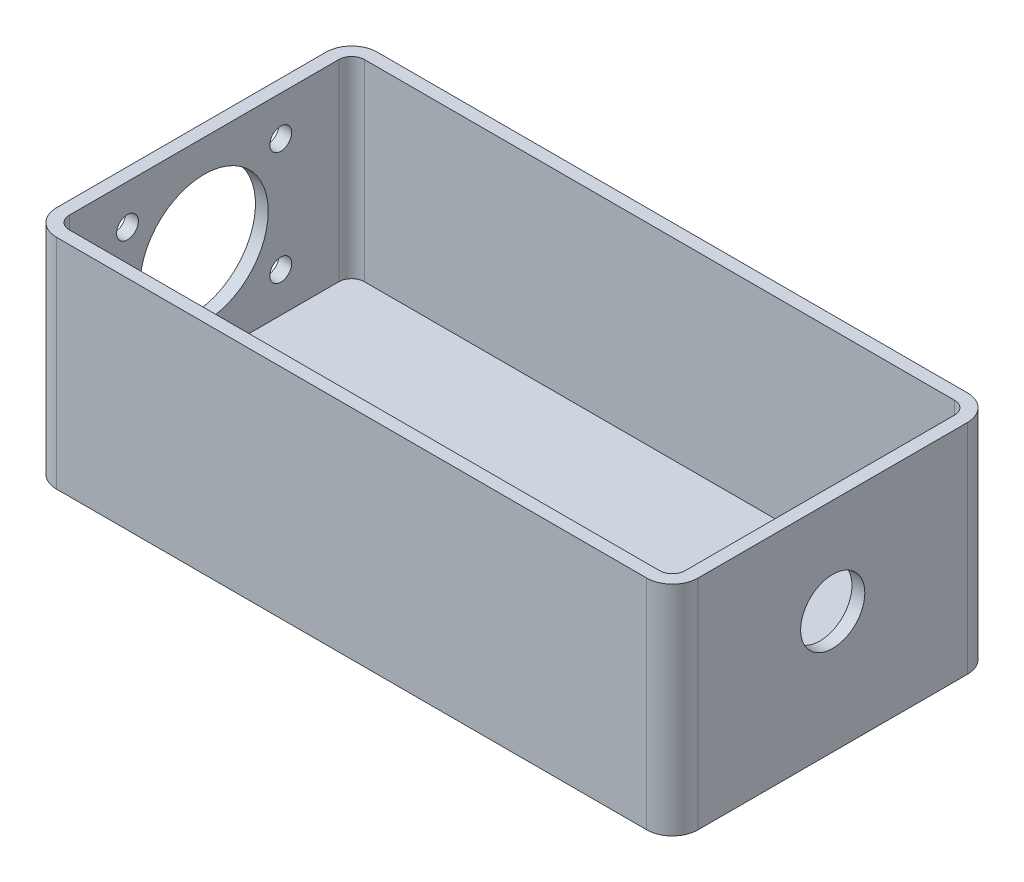
ISO-10303-21;
HEADER;
FILE_DESCRIPTION(('STEP AP214'),'2;1');
FILE_NAME('part.step','',(''),(''),'','','');
FILE_SCHEMA(('AUTOMOTIVE_DESIGN { 1 0 10303 214 1 1 1 1 }'));
ENDSEC;
DATA;
#1=APPLICATION_CONTEXT('core data for automotive mechanical design processes');
#2=APPLICATION_PROTOCOL_DEFINITION('international standard','automotive_design',2000,#1);
#3=PRODUCT_CONTEXT('',#1,'mechanical');
#4=PRODUCT('Part','Part','',(#3));
#5=PRODUCT_RELATED_PRODUCT_CATEGORY('part','',(#4));
#6=PRODUCT_DEFINITION_FORMATION('','',#4);
#7=PRODUCT_DEFINITION_CONTEXT('part definition',#1,'design');
#8=PRODUCT_DEFINITION('design','',#6,#7);
#9=PRODUCT_DEFINITION_SHAPE('','',#8);
#10=(LENGTH_UNIT() NAMED_UNIT(*) SI_UNIT(.MILLI.,.METRE.));
#11=(NAMED_UNIT(*) PLANE_ANGLE_UNIT() SI_UNIT($,.RADIAN.));
#12=(NAMED_UNIT(*) SI_UNIT($,.STERADIAN.) SOLID_ANGLE_UNIT());
#13=UNCERTAINTY_MEASURE_WITH_UNIT(LENGTH_MEASURE(1.E-05),#10,'distance_accuracy_value','');
#14=(GEOMETRIC_REPRESENTATION_CONTEXT(3) GLOBAL_UNCERTAINTY_ASSIGNED_CONTEXT((#13)) GLOBAL_UNIT_ASSIGNED_CONTEXT((#10,
#11,#12)) REPRESENTATION_CONTEXT('',''));
#15=CARTESIAN_POINT('',(0.,0.,0.));
#16=DIRECTION('',(0.,0.,1.));
#17=DIRECTION('',(1.,0.,0.));
#18=AXIS2_PLACEMENT_3D('',#15,#16,#17);
#19=CARTESIAN_POINT('',(0.,5.08,0.));
#20=DIRECTION('',(1.,0.,0.));
#21=DIRECTION('',(0.,0.,-1.));
#22=AXIS2_PLACEMENT_3D('',#19,#20,#21);
#23=PLANE('',#22);
#24=CARTESIAN_POINT('',(0.,12.9032,-16.5735));
#25=DIRECTION('',(-1.,0.,0.));
#26=DIRECTION('',(0.,0.,1.));
#27=AXIS2_PLACEMENT_3D('',#24,#25,#26);
#28=CIRCLE('',#27,2.159);
#29=CARTESIAN_POINT('',(0.,12.9032,-14.4145));
#30=VERTEX_POINT('',#29);
#31=EDGE_CURVE('E569',#30,#30,#28,.T.);
#32=ORIENTED_EDGE('',*,*,#31,.F.);
#33=EDGE_LOOP('',(#32));
#34=FACE_BOUND('',#33,.T.);
#35=CARTESIAN_POINT('',(0.,12.9032,-46.9265));
#36=DIRECTION('',(-1.,0.,0.));
#37=DIRECTION('',(0.,0.,1.));
#38=AXIS2_PLACEMENT_3D('',#35,#36,#37);
#39=CIRCLE('',#38,2.159);
#40=CARTESIAN_POINT('',(0.,12.9032,-44.7675));
#41=VERTEX_POINT('',#40);
#42=EDGE_CURVE('E577',#41,#41,#39,.T.);
#43=ORIENTED_EDGE('',*,*,#42,.F.);
#44=EDGE_LOOP('',(#43));
#45=FACE_BOUND('',#44,.T.);
#46=CARTESIAN_POINT('',(0.,35.3568,-16.5735));
#47=DIRECTION('',(-1.,0.,0.));
#48=DIRECTION('',(0.,0.,1.));
#49=AXIS2_PLACEMENT_3D('',#46,#47,#48);
#50=CIRCLE('',#49,2.159);
#51=CARTESIAN_POINT('',(0.,35.3568,-14.4145));
#52=VERTEX_POINT('',#51);
#53=EDGE_CURVE('E583',#52,#52,#50,.T.);
#54=ORIENTED_EDGE('',*,*,#53,.F.);
#55=EDGE_LOOP('',(#54));
#56=FACE_BOUND('',#55,.T.);
#57=CARTESIAN_POINT('',(0.,35.3568,-46.9265));
#58=DIRECTION('',(-1.,0.,0.));
#59=DIRECTION('',(0.,0.,1.));
#60=AXIS2_PLACEMENT_3D('',#57,#58,#59);
#61=CIRCLE('',#60,2.159);
#62=CARTESIAN_POINT('',(0.,35.3568,-44.7675));
#63=VERTEX_POINT('',#62);
#64=EDGE_CURVE('E557',#63,#63,#61,.T.);
#65=ORIENTED_EDGE('',*,*,#64,.F.);
#66=EDGE_LOOP('',(#65));
#67=FACE_BOUND('',#66,.T.);
#68=CARTESIAN_POINT('',(0.,24.13,-31.75));
#69=DIRECTION('',(-1.,0.,0.));
#70=DIRECTION('',(0.,0.,1.));
#71=AXIS2_PLACEMENT_3D('',#68,#69,#70);
#72=CIRCLE('',#71,12.7);
#73=CARTESIAN_POINT('',(0.,24.13,-19.05));
#74=VERTEX_POINT('',#73);
#75=EDGE_CURVE('E276',#74,#74,#72,.T.);
#76=ORIENTED_EDGE('',*,*,#75,.F.);
#77=EDGE_LOOP('',(#76));
#78=FACE_BOUND('',#77,.T.);
#79=DIRECTION('',(0.,0.,1.));
#80=VECTOR('',#79,1.);
#81=CARTESIAN_POINT('',(0.,43.18,-63.5));
#82=LINE('',#81,#80);
#83=CARTESIAN_POINT('',(0.,43.18,-58.42));
#84=VERTEX_POINT('',#83);
#85=CARTESIAN_POINT('',(0.,43.18,-5.08));
#86=VERTEX_POINT('',#85);
#87=EDGE_CURVE('E165',#84,#86,#82,.T.);
#88=ORIENTED_EDGE('',*,*,#87,.F.);
#89=DIRECTION('',(0.,-1.,0.));
#90=VECTOR('',#89,1.);
#91=CARTESIAN_POINT('',(0.,5.08,-58.42));
#92=LINE('',#91,#90);
#93=CARTESIAN_POINT('',(0.,0.,-58.42));
#94=VERTEX_POINT('',#93);
#95=EDGE_CURVE('E150',#84,#94,#92,.T.);
#96=ORIENTED_EDGE('',*,*,#95,.T.);
#97=DIRECTION('',(0.,0.,1.));
#98=VECTOR('',#97,1.);
#99=CARTESIAN_POINT('',(0.,0.,0.));
#100=LINE('',#99,#98);
#101=CARTESIAN_POINT('',(0.,0.,-5.08));
#102=VERTEX_POINT('',#101);
#103=EDGE_CURVE('E162',#94,#102,#100,.T.);
#104=ORIENTED_EDGE('',*,*,#103,.T.);
#105=DIRECTION('',(0.,-1.,0.));
#106=VECTOR('',#105,1.);
#107=CARTESIAN_POINT('',(0.,5.08,-5.08));
#108=LINE('',#107,#106);
#109=EDGE_CURVE('E167',#102,#86,#108,.F.);
#110=ORIENTED_EDGE('',*,*,#109,.T.);
#111=EDGE_LOOP('',(#88,#96,#104,#110));
#112=FACE_BOUND('',#111,.T.);
#113=ADVANCED_FACE('F33',(#34,#45,#56,#67,#78,#112),#23,.F.);
#114=CARTESIAN_POINT('',(0.,5.08,0.));
#115=DIRECTION('',(0.,0.,-1.));
#116=DIRECTION('',(-1.,0.,0.));
#117=AXIS2_PLACEMENT_3D('',#114,#115,#116);
#118=PLANE('',#117);
#119=DIRECTION('',(1.,0.,0.));
#120=VECTOR('',#119,1.);
#121=CARTESIAN_POINT('',(0.,0.,0.));
#122=LINE('',#121,#120);
#123=CARTESIAN_POINT('',(5.08,0.,0.));
#124=VERTEX_POINT('',#123);
#125=CARTESIAN_POINT('',(121.92,0.,0.));
#126=VERTEX_POINT('',#125);
#127=EDGE_CURVE('E171',#124,#126,#122,.T.);
#128=ORIENTED_EDGE('',*,*,#127,.T.);
#129=DIRECTION('',(0.,-1.,0.));
#130=VECTOR('',#129,1.);
#131=CARTESIAN_POINT('',(121.92,5.08,0.));
#132=LINE('',#131,#130);
#133=CARTESIAN_POINT('',(121.92,43.18,0.));
#134=VERTEX_POINT('',#133);
#135=EDGE_CURVE('E210',#126,#134,#132,.F.);
#136=ORIENTED_EDGE('',*,*,#135,.T.);
#137=DIRECTION('',(1.,0.,0.));
#138=VECTOR('',#137,1.);
#139=CARTESIAN_POINT('',(0.,43.18,0.));
#140=LINE('',#139,#138);
#141=CARTESIAN_POINT('',(5.08,43.18,0.));
#142=VERTEX_POINT('',#141);
#143=EDGE_CURVE('E282',#142,#134,#140,.T.);
#144=ORIENTED_EDGE('',*,*,#143,.F.);
#145=DIRECTION('',(0.,-1.,0.));
#146=VECTOR('',#145,1.);
#147=CARTESIAN_POINT('',(5.08,5.08,0.));
#148=LINE('',#147,#146);
#149=EDGE_CURVE('E207',#142,#124,#148,.T.);
#150=ORIENTED_EDGE('',*,*,#149,.T.);
#151=EDGE_LOOP('',(#128,#136,#144,#150));
#152=FACE_BOUND('',#151,.T.);
#153=ADVANCED_FACE('F305',(#152),#118,.F.);
#154=CARTESIAN_POINT('',(127.,5.08,0.));
#155=DIRECTION('',(-1.,0.,0.));
#156=DIRECTION('',(0.,0.,1.));
#157=AXIS2_PLACEMENT_3D('',#154,#155,#156);
#158=PLANE('',#157);
#159=CARTESIAN_POINT('',(127.,24.13,-31.75));
#160=DIRECTION('',(1.,0.,0.));
#161=DIRECTION('',(0.,0.,-1.));
#162=AXIS2_PLACEMENT_3D('',#159,#160,#161);
#163=CIRCLE('',#162,6.35);
#164=CARTESIAN_POINT('',(127.,24.13,-38.1));
#165=VERTEX_POINT('',#164);
#166=EDGE_CURVE('E576',#165,#165,#163,.T.);
#167=ORIENTED_EDGE('',*,*,#166,.F.);
#168=EDGE_LOOP('',(#167));
#169=FACE_BOUND('',#168,.T.);
#170=DIRECTION('',(0.,0.,-1.));
#171=VECTOR('',#170,1.);
#172=CARTESIAN_POINT('',(127.,0.,0.));
#173=LINE('',#172,#171);
#174=CARTESIAN_POINT('',(127.,0.,-5.08));
#175=VERTEX_POINT('',#174);
#176=CARTESIAN_POINT('',(127.,0.,-58.42));
#177=VERTEX_POINT('',#176);
#178=EDGE_CURVE('E175',#175,#177,#173,.T.);
#179=ORIENTED_EDGE('',*,*,#178,.T.);
#180=DIRECTION('',(0.,-1.,0.));
#181=VECTOR('',#180,1.);
#182=CARTESIAN_POINT('',(127.,5.08,-58.42));
#183=LINE('',#182,#181);
#184=CARTESIAN_POINT('',(127.,43.18,-58.42));
#185=VERTEX_POINT('',#184);
#186=EDGE_CURVE('E205',#177,#185,#183,.F.);
#187=ORIENTED_EDGE('',*,*,#186,.T.);
#188=DIRECTION('',(0.,0.,-1.));
#189=VECTOR('',#188,1.);
#190=CARTESIAN_POINT('',(127.,43.18,-63.5));
#191=LINE('',#190,#189);
#192=CARTESIAN_POINT('',(127.,43.18,-5.08));
#193=VERTEX_POINT('',#192);
#194=EDGE_CURVE('E178',#193,#185,#191,.T.);
#195=ORIENTED_EDGE('',*,*,#194,.F.);
#196=DIRECTION('',(0.,-1.,0.));
#197=VECTOR('',#196,1.);
#198=CARTESIAN_POINT('',(127.,5.08,-5.08));
#199=LINE('',#198,#197);
#200=EDGE_CURVE('E202',#193,#175,#199,.T.);
#201=ORIENTED_EDGE('',*,*,#200,.T.);
#202=EDGE_LOOP('',(#179,#187,#195,#201));
#203=FACE_BOUND('',#202,.T.);
#204=ADVANCED_FACE('F300',(#169,#203),#158,.F.);
#205=CARTESIAN_POINT('',(0.,5.08,-63.5));
#206=DIRECTION('',(0.,0.,1.));
#207=DIRECTION('',(1.,0.,0.));
#208=AXIS2_PLACEMENT_3D('',#205,#206,#207);
#209=PLANE('',#208);
#210=DIRECTION('',(-1.,0.,0.));
#211=VECTOR('',#210,1.);
#212=CARTESIAN_POINT('',(0.,0.,-63.5));
#213=LINE('',#212,#211);
#214=CARTESIAN_POINT('',(121.92,0.,-63.5));
#215=VERTEX_POINT('',#214);
#216=CARTESIAN_POINT('',(5.08,0.,-63.5));
#217=VERTEX_POINT('',#216);
#218=EDGE_CURVE('E184',#215,#217,#213,.T.);
#219=ORIENTED_EDGE('',*,*,#218,.T.);
#220=DIRECTION('',(0.,-1.,0.));
#221=VECTOR('',#220,1.);
#222=CARTESIAN_POINT('',(5.08,5.08,-63.5));
#223=LINE('',#222,#221);
#224=CARTESIAN_POINT('',(5.08,43.18,-63.5));
#225=VERTEX_POINT('',#224);
#226=EDGE_CURVE('E151',#217,#225,#223,.F.);
#227=ORIENTED_EDGE('',*,*,#226,.T.);
#228=DIRECTION('',(-1.,0.,0.));
#229=VECTOR('',#228,1.);
#230=CARTESIAN_POINT('',(0.,43.18,-63.5));
#231=LINE('',#230,#229);
#232=CARTESIAN_POINT('',(121.92,43.18,-63.5));
#233=VERTEX_POINT('',#232);
#234=EDGE_CURVE('E172',#233,#225,#231,.T.);
#235=ORIENTED_EDGE('',*,*,#234,.F.);
#236=DIRECTION('',(0.,-1.,0.));
#237=VECTOR('',#236,1.);
#238=CARTESIAN_POINT('',(121.92,5.08,-63.5));
#239=LINE('',#238,#237);
#240=EDGE_CURVE('E156',#233,#215,#239,.T.);
#241=ORIENTED_EDGE('',*,*,#240,.T.);
#242=EDGE_LOOP('',(#219,#227,#235,#241));
#243=FACE_BOUND('',#242,.T.);
#244=ADVANCED_FACE('F298',(#243),#209,.F.);
#245=CARTESIAN_POINT('',(0.,0.,0.));
#246=DIRECTION('',(0.,-1.,0.));
#247=DIRECTION('',(0.,0.,-1.));
#248=AXIS2_PLACEMENT_3D('',#245,#246,#247);
#249=PLANE('',#248);
#250=ORIENTED_EDGE('',*,*,#103,.F.);
#251=CARTESIAN_POINT('',(5.08,0.,-58.42));
#252=DIRECTION('',(0.,-1.,0.));
#253=DIRECTION('',(0.,0.,-1.));
#254=AXIS2_PLACEMENT_3D('',#251,#252,#253);
#255=CIRCLE('',#254,5.08);
#256=EDGE_CURVE('E146',#94,#217,#255,.T.);
#257=ORIENTED_EDGE('',*,*,#256,.T.);
#258=ORIENTED_EDGE('',*,*,#218,.F.);
#259=CARTESIAN_POINT('',(121.92,0.,-58.42));
#260=DIRECTION('',(0.,-1.,0.));
#261=DIRECTION('',(0.,0.,-1.));
#262=AXIS2_PLACEMENT_3D('',#259,#260,#261);
#263=CIRCLE('',#262,5.08);
#264=EDGE_CURVE('E157',#215,#177,#263,.T.);
#265=ORIENTED_EDGE('',*,*,#264,.T.);
#266=ORIENTED_EDGE('',*,*,#178,.F.);
#267=CARTESIAN_POINT('',(121.92,0.,-5.08));
#268=DIRECTION('',(0.,-1.,0.));
#269=DIRECTION('',(0.,0.,-1.));
#270=AXIS2_PLACEMENT_3D('',#267,#268,#269);
#271=CIRCLE('',#270,5.08);
#272=EDGE_CURVE('E188',#175,#126,#271,.T.);
#273=ORIENTED_EDGE('',*,*,#272,.T.);
#274=ORIENTED_EDGE('',*,*,#127,.F.);
#275=CARTESIAN_POINT('',(5.08,0.,-5.08));
#276=DIRECTION('',(0.,-1.,0.));
#277=DIRECTION('',(0.,0.,-1.));
#278=AXIS2_PLACEMENT_3D('',#275,#276,#277);
#279=CIRCLE('',#278,5.08);
#280=EDGE_CURVE('E166',#124,#102,#279,.T.);
#281=ORIENTED_EDGE('',*,*,#280,.T.);
#282=EDGE_LOOP('',(#250,#257,#258,#265,#266,#273,#274,#281));
#283=FACE_BOUND('',#282,.T.);
#284=ADVANCED_FACE('F169',(#283),#249,.T.);
#285=CARTESIAN_POINT('',(0.,43.18,0.));
#286=DIRECTION('',(0.,1.,0.));
#287=DIRECTION('',(0.,0.,1.));
#288=AXIS2_PLACEMENT_3D('',#285,#286,#287);
#289=PLANE('',#288);
#290=ORIENTED_EDGE('',*,*,#234,.T.);
#291=CARTESIAN_POINT('',(5.08,43.18,-58.42));
#292=DIRECTION('',(0.,1.,0.));
#293=DIRECTION('',(0.,0.,1.));
#294=AXIS2_PLACEMENT_3D('',#291,#292,#293);
#295=CIRCLE('',#294,5.08);
#296=EDGE_CURVE('E200',#225,#84,#295,.T.);
#297=ORIENTED_EDGE('',*,*,#296,.T.);
#298=ORIENTED_EDGE('',*,*,#87,.T.);
#299=CARTESIAN_POINT('',(5.08,43.18,-5.08));
#300=DIRECTION('',(0.,1.,0.));
#301=DIRECTION('',(0.,0.,1.));
#302=AXIS2_PLACEMENT_3D('',#299,#300,#301);
#303=CIRCLE('',#302,5.08);
#304=EDGE_CURVE('E194',#86,#142,#303,.T.);
#305=ORIENTED_EDGE('',*,*,#304,.T.);
#306=ORIENTED_EDGE('',*,*,#143,.T.);
#307=CARTESIAN_POINT('',(121.92,43.18,-5.08));
#308=DIRECTION('',(0.,1.,0.));
#309=DIRECTION('',(0.,0.,1.));
#310=AXIS2_PLACEMENT_3D('',#307,#308,#309);
#311=CIRCLE('',#310,5.08);
#312=EDGE_CURVE('E196',#134,#193,#311,.T.);
#313=ORIENTED_EDGE('',*,*,#312,.T.);
#314=ORIENTED_EDGE('',*,*,#194,.T.);
#315=CARTESIAN_POINT('',(121.92,43.18,-58.42));
#316=DIRECTION('',(0.,1.,0.));
#317=DIRECTION('',(0.,0.,1.));
#318=AXIS2_PLACEMENT_3D('',#315,#316,#317);
#319=CIRCLE('',#318,5.08);
#320=EDGE_CURVE('E198',#185,#233,#319,.T.);
#321=ORIENTED_EDGE('',*,*,#320,.T.);
#322=EDGE_LOOP('',(#290,#297,#298,#305,#306,#313,#314,#321));
#323=FACE_BOUND('',#322,.T.);
#324=DIRECTION('',(1.,0.,0.));
#325=VECTOR('',#324,1.);
#326=CARTESIAN_POINT('',(2.54000000000001,43.18,-2.54));
#327=LINE('',#326,#325);
#328=CARTESIAN_POINT('',(5.08000000000001,43.18,-2.54));
#329=VERTEX_POINT('',#328);
#330=CARTESIAN_POINT('',(121.92,43.18,-2.54));
#331=VERTEX_POINT('',#330);
#332=EDGE_CURVE('E250',#329,#331,#327,.T.);
#333=ORIENTED_EDGE('',*,*,#332,.F.);
#334=CARTESIAN_POINT('',(5.08000000000001,43.18,-5.08));
#335=DIRECTION('',(0.,1.,0.));
#336=DIRECTION('',(0.,0.,1.));
#337=AXIS2_PLACEMENT_3D('',#334,#335,#336);
#338=CIRCLE('',#337,2.54);
#339=CARTESIAN_POINT('',(2.54000000000001,43.18,-5.08));
#340=VERTEX_POINT('',#339);
#341=EDGE_CURVE('E241',#329,#340,#338,.F.);
#342=ORIENTED_EDGE('',*,*,#341,.T.);
#343=DIRECTION('',(0.,0.,1.));
#344=VECTOR('',#343,1.);
#345=CARTESIAN_POINT('',(2.54,43.18,-60.96));
#346=LINE('',#345,#344);
#347=CARTESIAN_POINT('',(2.54,43.18,-58.42));
#348=VERTEX_POINT('',#347);
#349=EDGE_CURVE('E247',#348,#340,#346,.T.);
#350=ORIENTED_EDGE('',*,*,#349,.F.);
#351=CARTESIAN_POINT('',(5.08,43.18,-58.42));
#352=DIRECTION('',(0.,1.,0.));
#353=DIRECTION('',(0.,0.,1.));
#354=AXIS2_PLACEMENT_3D('',#351,#352,#353);
#355=CIRCLE('',#354,2.54);
#356=CARTESIAN_POINT('',(5.08,43.18,-60.96));
#357=VERTEX_POINT('',#356);
#358=EDGE_CURVE('E239',#348,#357,#355,.F.);
#359=ORIENTED_EDGE('',*,*,#358,.T.);
#360=DIRECTION('',(-1.,0.,0.));
#361=VECTOR('',#360,1.);
#362=CARTESIAN_POINT('',(2.54,43.18,-60.96));
#363=LINE('',#362,#361);
#364=CARTESIAN_POINT('',(121.92,43.18,-60.96));
#365=VERTEX_POINT('',#364);
#366=EDGE_CURVE('E283',#365,#357,#363,.T.);
#367=ORIENTED_EDGE('',*,*,#366,.F.);
#368=CARTESIAN_POINT('',(121.92,43.18,-58.42));
#369=DIRECTION('',(0.,1.,0.));
#370=DIRECTION('',(0.,0.,1.));
#371=AXIS2_PLACEMENT_3D('',#368,#369,#370);
#372=CIRCLE('',#371,2.54);
#373=CARTESIAN_POINT('',(124.46,43.18,-58.42));
#374=VERTEX_POINT('',#373);
#375=EDGE_CURVE('E41',#365,#374,#372,.F.);
#376=ORIENTED_EDGE('',*,*,#375,.T.);
#377=DIRECTION('',(0.,0.,-1.));
#378=VECTOR('',#377,1.);
#379=CARTESIAN_POINT('',(124.46,43.18,-60.96));
#380=LINE('',#379,#378);
#381=CARTESIAN_POINT('',(124.46,43.18,-5.08));
#382=VERTEX_POINT('',#381);
#383=EDGE_CURVE('E562',#382,#374,#380,.T.);
#384=ORIENTED_EDGE('',*,*,#383,.F.);
#385=CARTESIAN_POINT('',(121.92,43.18,-5.08));
#386=DIRECTION('',(0.,1.,0.));
#387=DIRECTION('',(0.,0.,1.));
#388=AXIS2_PLACEMENT_3D('',#385,#386,#387);
#389=CIRCLE('',#388,2.54);
#390=EDGE_CURVE('E11',#382,#331,#389,.F.);
#391=ORIENTED_EDGE('',*,*,#390,.T.);
#392=EDGE_LOOP('',(#333,#342,#350,#359,#367,#376,#384,#391));
#393=FACE_BOUND('',#392,.T.);
#394=ADVANCED_FACE('F246',(#323,#393),#289,.T.);
#395=CARTESIAN_POINT('',(2.54,43.18,-60.96));
#396=DIRECTION('',(1.,0.,0.));
#397=DIRECTION('',(0.,0.,-1.));
#398=AXIS2_PLACEMENT_3D('',#395,#396,#397);
#399=PLANE('',#398);
#400=CARTESIAN_POINT('',(2.54,12.9032,-16.5735));
#401=DIRECTION('',(1.,0.,0.));
#402=DIRECTION('',(0.,0.,-1.));
#403=AXIS2_PLACEMENT_3D('',#400,#401,#402);
#404=CIRCLE('',#403,2.159);
#405=CARTESIAN_POINT('',(2.54,12.9032,-18.7325));
#406=VERTEX_POINT('',#405);
#407=EDGE_CURVE('E573',#406,#406,#404,.F.);
#408=ORIENTED_EDGE('',*,*,#407,.T.);
#409=EDGE_LOOP('',(#408));
#410=FACE_BOUND('',#409,.T.);
#411=CARTESIAN_POINT('',(2.54,12.9032,-46.9265));
#412=DIRECTION('',(1.,0.,0.));
#413=DIRECTION('',(0.,0.,-1.));
#414=AXIS2_PLACEMENT_3D('',#411,#412,#413);
#415=CIRCLE('',#414,2.159);
#416=CARTESIAN_POINT('',(2.54,12.9032,-49.0855));
#417=VERTEX_POINT('',#416);
#418=EDGE_CURVE('E572',#417,#417,#415,.F.);
#419=ORIENTED_EDGE('',*,*,#418,.T.);
#420=EDGE_LOOP('',(#419));
#421=FACE_BOUND('',#420,.T.);
#422=CARTESIAN_POINT('',(2.54,35.3568,-16.5735));
#423=DIRECTION('',(1.,0.,0.));
#424=DIRECTION('',(0.,0.,-1.));
#425=AXIS2_PLACEMENT_3D('',#422,#423,#424);
#426=CIRCLE('',#425,2.159);
#427=CARTESIAN_POINT('',(2.54,35.3568,-18.7325));
#428=VERTEX_POINT('',#427);
#429=EDGE_CURVE('E580',#428,#428,#426,.F.);
#430=ORIENTED_EDGE('',*,*,#429,.T.);
#431=EDGE_LOOP('',(#430));
#432=FACE_BOUND('',#431,.T.);
#433=CARTESIAN_POINT('',(2.54,35.3568,-46.9265));
#434=DIRECTION('',(1.,0.,0.));
#435=DIRECTION('',(0.,0.,-1.));
#436=AXIS2_PLACEMENT_3D('',#433,#434,#435);
#437=CIRCLE('',#436,2.159);
#438=CARTESIAN_POINT('',(2.54,35.3568,-49.0855));
#439=VERTEX_POINT('',#438);
#440=EDGE_CURVE('E586',#439,#439,#437,.F.);
#441=ORIENTED_EDGE('',*,*,#440,.T.);
#442=EDGE_LOOP('',(#441));
#443=FACE_BOUND('',#442,.T.);
#444=CARTESIAN_POINT('',(2.54,24.13,-31.75));
#445=DIRECTION('',(1.,0.,0.));
#446=DIRECTION('',(0.,0.,-1.));
#447=AXIS2_PLACEMENT_3D('',#444,#445,#446);
#448=CIRCLE('',#447,12.7);
#449=CARTESIAN_POINT('',(2.54,24.13,-44.45));
#450=VERTEX_POINT('',#449);
#451=EDGE_CURVE('E552',#450,#450,#448,.F.);
#452=ORIENTED_EDGE('',*,*,#451,.T.);
#453=EDGE_LOOP('',(#452));
#454=FACE_BOUND('',#453,.T.);
#455=DIRECTION('',(0.,0.,1.));
#456=VECTOR('',#455,1.);
#457=CARTESIAN_POINT('',(2.54,5.08,-60.96));
#458=LINE('',#457,#456);
#459=CARTESIAN_POINT('',(2.54,5.08,-58.42));
#460=VERTEX_POINT('',#459);
#461=CARTESIAN_POINT('',(2.54000000000001,5.08,-5.08));
#462=VERTEX_POINT('',#461);
#463=EDGE_CURVE('E268',#460,#462,#458,.T.);
#464=ORIENTED_EDGE('',*,*,#463,.F.);
#465=DIRECTION('',(0.,-1.,0.));
#466=VECTOR('',#465,1.);
#467=CARTESIAN_POINT('',(2.54,43.18,-58.42));
#468=LINE('',#467,#466);
#469=EDGE_CURVE('E228',#460,#348,#468,.F.);
#470=ORIENTED_EDGE('',*,*,#469,.T.);
#471=ORIENTED_EDGE('',*,*,#349,.T.);
#472=DIRECTION('',(0.,-1.,0.));
#473=VECTOR('',#472,1.);
#474=CARTESIAN_POINT('',(2.54000000000001,5.08,-5.08));
#475=LINE('',#474,#473);
#476=EDGE_CURVE('E225',#340,#462,#475,.T.);
#477=ORIENTED_EDGE('',*,*,#476,.T.);
#478=EDGE_LOOP('',(#464,#470,#471,#477));
#479=FACE_BOUND('',#478,.T.);
#480=ADVANCED_FACE('F256',(#410,#421,#432,#443,#454,#479),#399,.T.);
#481=CARTESIAN_POINT('',(2.54000000000001,43.18,-2.54));
#482=DIRECTION('',(0.,0.,-1.));
#483=DIRECTION('',(-1.,0.,0.));
#484=AXIS2_PLACEMENT_3D('',#481,#482,#483);
#485=PLANE('',#484);
#486=DIRECTION('',(1.,0.,0.));
#487=VECTOR('',#486,1.);
#488=CARTESIAN_POINT('',(2.54000000000001,5.08,-2.54));
#489=LINE('',#488,#487);
#490=CARTESIAN_POINT('',(5.08000000000001,5.08,-2.54));
#491=VERTEX_POINT('',#490);
#492=CARTESIAN_POINT('',(121.92,5.08,-2.54));
#493=VERTEX_POINT('',#492);
#494=EDGE_CURVE('E267',#491,#493,#489,.T.);
#495=ORIENTED_EDGE('',*,*,#494,.F.);
#496=DIRECTION('',(0.,-1.,0.));
#497=VECTOR('',#496,1.);
#498=CARTESIAN_POINT('',(5.08000000000001,43.18,-2.54));
#499=LINE('',#498,#497);
#500=EDGE_CURVE('E233',#491,#329,#499,.F.);
#501=ORIENTED_EDGE('',*,*,#500,.T.);
#502=ORIENTED_EDGE('',*,*,#332,.T.);
#503=DIRECTION('',(0.,-1.,0.));
#504=VECTOR('',#503,1.);
#505=CARTESIAN_POINT('',(121.92,5.08,-2.54));
#506=LINE('',#505,#504);
#507=EDGE_CURVE('E230',#331,#493,#506,.T.);
#508=ORIENTED_EDGE('',*,*,#507,.T.);
#509=EDGE_LOOP('',(#495,#501,#502,#508));
#510=FACE_BOUND('',#509,.T.);
#511=ADVANCED_FACE('F270',(#510),#485,.T.);
#512=CARTESIAN_POINT('',(124.46,43.18,-60.96));
#513=DIRECTION('',(-1.,0.,0.));
#514=DIRECTION('',(0.,0.,1.));
#515=AXIS2_PLACEMENT_3D('',#512,#513,#514);
#516=PLANE('',#515);
#517=CARTESIAN_POINT('',(124.46,24.13,-31.75));
#518=DIRECTION('',(-1.,0.,0.));
#519=DIRECTION('',(0.,0.,1.));
#520=AXIS2_PLACEMENT_3D('',#517,#518,#519);
#521=CIRCLE('',#520,6.35);
#522=CARTESIAN_POINT('',(124.46,24.13,-25.4));
#523=VERTEX_POINT('',#522);
#524=EDGE_CURVE('E593',#523,#523,#521,.F.);
#525=ORIENTED_EDGE('',*,*,#524,.T.);
#526=EDGE_LOOP('',(#525));
#527=FACE_BOUND('',#526,.T.);
#528=ORIENTED_EDGE('',*,*,#383,.T.);
#529=DIRECTION('',(0.,-1.,0.));
#530=VECTOR('',#529,1.);
#531=CARTESIAN_POINT('',(124.46,5.08,-58.42));
#532=LINE('',#531,#530);
#533=CARTESIAN_POINT('',(124.46,5.08,-58.42));
#534=VERTEX_POINT('',#533);
#535=EDGE_CURVE('E236',#374,#534,#532,.T.);
#536=ORIENTED_EDGE('',*,*,#535,.T.);
#537=DIRECTION('',(0.,0.,-1.));
#538=VECTOR('',#537,1.);
#539=CARTESIAN_POINT('',(124.46,5.08,-60.96));
#540=LINE('',#539,#538);
#541=CARTESIAN_POINT('',(124.46,5.08,-5.08));
#542=VERTEX_POINT('',#541);
#543=EDGE_CURVE('E272',#542,#534,#540,.T.);
#544=ORIENTED_EDGE('',*,*,#543,.F.);
#545=DIRECTION('',(0.,-1.,0.));
#546=VECTOR('',#545,1.);
#547=CARTESIAN_POINT('',(124.46,43.18,-5.08));
#548=LINE('',#547,#546);
#549=EDGE_CURVE('E54',#542,#382,#548,.F.);
#550=ORIENTED_EDGE('',*,*,#549,.T.);
#551=EDGE_LOOP('',(#528,#536,#544,#550));
#552=FACE_BOUND('',#551,.T.);
#553=ADVANCED_FACE('F378',(#527,#552),#516,.T.);
#554=CARTESIAN_POINT('',(2.54,43.18,-60.96));
#555=DIRECTION('',(0.,0.,1.));
#556=DIRECTION('',(1.,0.,0.));
#557=AXIS2_PLACEMENT_3D('',#554,#555,#556);
#558=PLANE('',#557);
#559=ORIENTED_EDGE('',*,*,#366,.T.);
#560=DIRECTION('',(0.,-1.,0.));
#561=VECTOR('',#560,1.);
#562=CARTESIAN_POINT('',(5.08,5.08,-60.96));
#563=LINE('',#562,#561);
#564=CARTESIAN_POINT('',(5.08,5.08,-60.96));
#565=VERTEX_POINT('',#564);
#566=EDGE_CURVE('E214',#357,#565,#563,.T.);
#567=ORIENTED_EDGE('',*,*,#566,.T.);
#568=DIRECTION('',(-1.,0.,0.));
#569=VECTOR('',#568,1.);
#570=CARTESIAN_POINT('',(2.54,5.08,-60.96));
#571=LINE('',#570,#569);
#572=CARTESIAN_POINT('',(121.92,5.08,-60.96));
#573=VERTEX_POINT('',#572);
#574=EDGE_CURVE('E259',#573,#565,#571,.T.);
#575=ORIENTED_EDGE('',*,*,#574,.F.);
#576=DIRECTION('',(0.,-1.,0.));
#577=VECTOR('',#576,1.);
#578=CARTESIAN_POINT('',(121.92,43.18,-60.96));
#579=LINE('',#578,#577);
#580=EDGE_CURVE('E212',#573,#365,#579,.F.);
#581=ORIENTED_EDGE('',*,*,#580,.T.);
#582=EDGE_LOOP('',(#559,#567,#575,#581));
#583=FACE_BOUND('',#582,.T.);
#584=ADVANCED_FACE('F385',(#583),#558,.T.);
#585=CARTESIAN_POINT('',(0.,5.08,0.));
#586=DIRECTION('',(0.,-1.,0.));
#587=DIRECTION('',(0.,0.,-1.));
#588=AXIS2_PLACEMENT_3D('',#585,#586,#587);
#589=PLANE('',#588);
#590=ORIENTED_EDGE('',*,*,#574,.T.);
#591=CARTESIAN_POINT('',(5.08,5.08,-58.42));
#592=DIRECTION('',(0.,-1.,0.));
#593=DIRECTION('',(0.,0.,-1.));
#594=AXIS2_PLACEMENT_3D('',#591,#592,#593);
#595=CIRCLE('',#594,2.54);
#596=EDGE_CURVE('E223',#565,#460,#595,.F.);
#597=ORIENTED_EDGE('',*,*,#596,.T.);
#598=ORIENTED_EDGE('',*,*,#463,.T.);
#599=CARTESIAN_POINT('',(5.08000000000001,5.08,-5.08));
#600=DIRECTION('',(0.,-1.,0.));
#601=DIRECTION('',(0.,0.,-1.));
#602=AXIS2_PLACEMENT_3D('',#599,#600,#601);
#603=CIRCLE('',#602,2.54);
#604=EDGE_CURVE('E221',#462,#491,#603,.F.);
#605=ORIENTED_EDGE('',*,*,#604,.T.);
#606=ORIENTED_EDGE('',*,*,#494,.T.);
#607=CARTESIAN_POINT('',(121.92,5.08,-5.08));
#608=DIRECTION('',(0.,-1.,0.));
#609=DIRECTION('',(0.,0.,-1.));
#610=AXIS2_PLACEMENT_3D('',#607,#608,#609);
#611=CIRCLE('',#610,2.54);
#612=EDGE_CURVE('E217',#493,#542,#611,.F.);
#613=ORIENTED_EDGE('',*,*,#612,.T.);
#614=ORIENTED_EDGE('',*,*,#543,.T.);
#615=CARTESIAN_POINT('',(121.92,5.08,-58.42));
#616=DIRECTION('',(0.,-1.,0.));
#617=DIRECTION('',(0.,0.,-1.));
#618=AXIS2_PLACEMENT_3D('',#615,#616,#617);
#619=CIRCLE('',#618,2.54);
#620=EDGE_CURVE('E219',#534,#573,#619,.F.);
#621=ORIENTED_EDGE('',*,*,#620,.T.);
#622=EDGE_LOOP('',(#590,#597,#598,#605,#606,#613,#614,#621));
#623=FACE_BOUND('',#622,.T.);
#624=ADVANCED_FACE('F266',(#623),#589,.F.);
#625=CARTESIAN_POINT('',(127.001,24.13,-31.75));
#626=DIRECTION('',(-1.,0.,0.));
#627=DIRECTION('',(0.,0.,1.));
#628=AXIS2_PLACEMENT_3D('',#625,#626,#627);
#629=CYLINDRICAL_SURFACE('',#628,12.7);
#630=ORIENTED_EDGE('',*,*,#451,.F.);
#631=EDGE_LOOP('',(#630));
#632=FACE_BOUND('',#631,.T.);
#633=ORIENTED_EDGE('',*,*,#75,.T.);
#634=EDGE_LOOP('',(#633));
#635=FACE_BOUND('',#634,.T.);
#636=ADVANCED_FACE('F400',(#632,#635),#629,.F.);
#637=CARTESIAN_POINT('',(127.001,35.3568,-46.9265));
#638=DIRECTION('',(-1.,0.,0.));
#639=DIRECTION('',(0.,0.,1.));
#640=AXIS2_PLACEMENT_3D('',#637,#638,#639);
#641=CYLINDRICAL_SURFACE('',#640,2.159);
#642=ORIENTED_EDGE('',*,*,#440,.F.);
#643=EDGE_LOOP('',(#642));
#644=FACE_BOUND('',#643,.T.);
#645=ORIENTED_EDGE('',*,*,#64,.T.);
#646=EDGE_LOOP('',(#645));
#647=FACE_BOUND('',#646,.T.);
#648=ADVANCED_FACE('F468',(#644,#647),#641,.F.);
#649=CARTESIAN_POINT('',(127.001,35.3568,-16.5735));
#650=DIRECTION('',(-1.,0.,0.));
#651=DIRECTION('',(0.,0.,1.));
#652=AXIS2_PLACEMENT_3D('',#649,#650,#651);
#653=CYLINDRICAL_SURFACE('',#652,2.159);
#654=ORIENTED_EDGE('',*,*,#429,.F.);
#655=EDGE_LOOP('',(#654));
#656=FACE_BOUND('',#655,.T.);
#657=ORIENTED_EDGE('',*,*,#53,.T.);
#658=EDGE_LOOP('',(#657));
#659=FACE_BOUND('',#658,.T.);
#660=ADVANCED_FACE('F471',(#656,#659),#653,.F.);
#661=CARTESIAN_POINT('',(127.001,12.9032,-46.9265));
#662=DIRECTION('',(-1.,0.,0.));
#663=DIRECTION('',(0.,0.,1.));
#664=AXIS2_PLACEMENT_3D('',#661,#662,#663);
#665=CYLINDRICAL_SURFACE('',#664,2.159);
#666=ORIENTED_EDGE('',*,*,#418,.F.);
#667=EDGE_LOOP('',(#666));
#668=FACE_BOUND('',#667,.T.);
#669=ORIENTED_EDGE('',*,*,#42,.T.);
#670=EDGE_LOOP('',(#669));
#671=FACE_BOUND('',#670,.T.);
#672=ADVANCED_FACE('F475',(#668,#671),#665,.F.);
#673=CARTESIAN_POINT('',(127.001,12.9032,-16.5735));
#674=DIRECTION('',(-1.,0.,0.));
#675=DIRECTION('',(0.,0.,1.));
#676=AXIS2_PLACEMENT_3D('',#673,#674,#675);
#677=CYLINDRICAL_SURFACE('',#676,2.159);
#678=ORIENTED_EDGE('',*,*,#407,.F.);
#679=EDGE_LOOP('',(#678));
#680=FACE_BOUND('',#679,.T.);
#681=ORIENTED_EDGE('',*,*,#31,.T.);
#682=EDGE_LOOP('',(#681));
#683=FACE_BOUND('',#682,.T.);
#684=ADVANCED_FACE('F334',(#680,#683),#677,.F.);
#685=CARTESIAN_POINT('',(5.08,5.08,-58.42));
#686=DIRECTION('',(0.,-1.,0.));
#687=DIRECTION('',(0.,0.,-1.));
#688=AXIS2_PLACEMENT_3D('',#685,#686,#687);
#689=CYLINDRICAL_SURFACE('',#688,5.08);
#690=ORIENTED_EDGE('',*,*,#296,.F.);
#691=ORIENTED_EDGE('',*,*,#226,.F.);
#692=ORIENTED_EDGE('',*,*,#256,.F.);
#693=ORIENTED_EDGE('',*,*,#95,.F.);
#694=EDGE_LOOP('',(#690,#691,#692,#693));
#695=FACE_BOUND('',#694,.T.);
#696=ADVANCED_FACE('F149',(#695),#689,.T.);
#697=CARTESIAN_POINT('',(121.92,5.08,-58.42));
#698=DIRECTION('',(0.,-1.,0.));
#699=DIRECTION('',(0.,0.,-1.));
#700=AXIS2_PLACEMENT_3D('',#697,#698,#699);
#701=CYLINDRICAL_SURFACE('',#700,5.08);
#702=ORIENTED_EDGE('',*,*,#320,.F.);
#703=ORIENTED_EDGE('',*,*,#186,.F.);
#704=ORIENTED_EDGE('',*,*,#264,.F.);
#705=ORIENTED_EDGE('',*,*,#240,.F.);
#706=EDGE_LOOP('',(#702,#703,#704,#705));
#707=FACE_BOUND('',#706,.T.);
#708=ADVANCED_FACE('F296',(#707),#701,.T.);
#709=CARTESIAN_POINT('',(121.92,5.08,-5.08));
#710=DIRECTION('',(0.,-1.,0.));
#711=DIRECTION('',(0.,0.,-1.));
#712=AXIS2_PLACEMENT_3D('',#709,#710,#711);
#713=CYLINDRICAL_SURFACE('',#712,5.08);
#714=ORIENTED_EDGE('',*,*,#312,.F.);
#715=ORIENTED_EDGE('',*,*,#135,.F.);
#716=ORIENTED_EDGE('',*,*,#272,.F.);
#717=ORIENTED_EDGE('',*,*,#200,.F.);
#718=EDGE_LOOP('',(#714,#715,#716,#717));
#719=FACE_BOUND('',#718,.T.);
#720=ADVANCED_FACE('F302',(#719),#713,.T.);
#721=CARTESIAN_POINT('',(5.08,5.08,-5.08));
#722=DIRECTION('',(0.,-1.,0.));
#723=DIRECTION('',(0.,0.,-1.));
#724=AXIS2_PLACEMENT_3D('',#721,#722,#723);
#725=CYLINDRICAL_SURFACE('',#724,5.08);
#726=ORIENTED_EDGE('',*,*,#304,.F.);
#727=ORIENTED_EDGE('',*,*,#109,.F.);
#728=ORIENTED_EDGE('',*,*,#280,.F.);
#729=ORIENTED_EDGE('',*,*,#149,.F.);
#730=EDGE_LOOP('',(#726,#727,#728,#729));
#731=FACE_BOUND('',#730,.T.);
#732=ADVANCED_FACE('F310',(#731),#725,.T.);
#733=CARTESIAN_POINT('',(5.08,43.18,-58.42));
#734=DIRECTION('',(0.,1.,0.));
#735=DIRECTION('',(0.,0.,1.));
#736=AXIS2_PLACEMENT_3D('',#733,#734,#735);
#737=CYLINDRICAL_SURFACE('',#736,2.54);
#738=ORIENTED_EDGE('',*,*,#358,.F.);
#739=ORIENTED_EDGE('',*,*,#469,.F.);
#740=ORIENTED_EDGE('',*,*,#596,.F.);
#741=ORIENTED_EDGE('',*,*,#566,.F.);
#742=EDGE_LOOP('',(#738,#739,#740,#741));
#743=FACE_BOUND('',#742,.T.);
#744=ADVANCED_FACE('F312',(#743),#737,.F.);
#745=CARTESIAN_POINT('',(5.08000000000001,43.18,-5.08));
#746=DIRECTION('',(0.,1.,0.));
#747=DIRECTION('',(0.,0.,1.));
#748=AXIS2_PLACEMENT_3D('',#745,#746,#747);
#749=CYLINDRICAL_SURFACE('',#748,2.54);
#750=ORIENTED_EDGE('',*,*,#341,.F.);
#751=ORIENTED_EDGE('',*,*,#500,.F.);
#752=ORIENTED_EDGE('',*,*,#604,.F.);
#753=ORIENTED_EDGE('',*,*,#476,.F.);
#754=EDGE_LOOP('',(#750,#751,#752,#753));
#755=FACE_BOUND('',#754,.T.);
#756=ADVANCED_FACE('F261',(#755),#749,.F.);
#757=CARTESIAN_POINT('',(121.92,43.18,-58.42));
#758=DIRECTION('',(0.,1.,0.));
#759=DIRECTION('',(0.,0.,1.));
#760=AXIS2_PLACEMENT_3D('',#757,#758,#759);
#761=CYLINDRICAL_SURFACE('',#760,2.54);
#762=ORIENTED_EDGE('',*,*,#375,.F.);
#763=ORIENTED_EDGE('',*,*,#580,.F.);
#764=ORIENTED_EDGE('',*,*,#620,.F.);
#765=ORIENTED_EDGE('',*,*,#535,.F.);
#766=EDGE_LOOP('',(#762,#763,#764,#765));
#767=FACE_BOUND('',#766,.T.);
#768=ADVANCED_FACE('F417',(#767),#761,.F.);
#769=CARTESIAN_POINT('',(121.92,43.18,-5.08));
#770=DIRECTION('',(0.,1.,0.));
#771=DIRECTION('',(0.,0.,1.));
#772=AXIS2_PLACEMENT_3D('',#769,#770,#771);
#773=CYLINDRICAL_SURFACE('',#772,2.54);
#774=ORIENTED_EDGE('',*,*,#390,.F.);
#775=ORIENTED_EDGE('',*,*,#549,.F.);
#776=ORIENTED_EDGE('',*,*,#612,.F.);
#777=ORIENTED_EDGE('',*,*,#507,.F.);
#778=EDGE_LOOP('',(#774,#775,#776,#777));
#779=FACE_BOUND('',#778,.T.);
#780=ADVANCED_FACE('F35',(#779),#773,.F.);
#781=CARTESIAN_POINT('',(-0.001000000000001,24.13,-31.75));
#782=DIRECTION('',(1.,0.,0.));
#783=DIRECTION('',(0.,0.,-1.));
#784=AXIS2_PLACEMENT_3D('',#781,#782,#783);
#785=CYLINDRICAL_SURFACE('',#784,6.35);
#786=ORIENTED_EDGE('',*,*,#524,.F.);
#787=EDGE_LOOP('',(#786));
#788=FACE_BOUND('',#787,.T.);
#789=ORIENTED_EDGE('',*,*,#166,.T.);
#790=EDGE_LOOP('',(#789));
#791=FACE_BOUND('',#790,.T.);
#792=ADVANCED_FACE('F434',(#788,#791),#785,.F.);
#793=CLOSED_SHELL('',(#113,#153,#204,#244,#284,#394,#480,#511,#553,#584,#624,#636,#648,#660,
#672,#684,#696,#708,#720,#732,#744,#756,#768,#780,#792));
#794=MANIFOLD_SOLID_BREP('B2',#793);
#795=ADVANCED_BREP_SHAPE_REPRESENTATION('',(#18,#794),#14);
#796=SHAPE_DEFINITION_REPRESENTATION(#9,#795);
ENDSEC;
END-ISO-10303-21;
